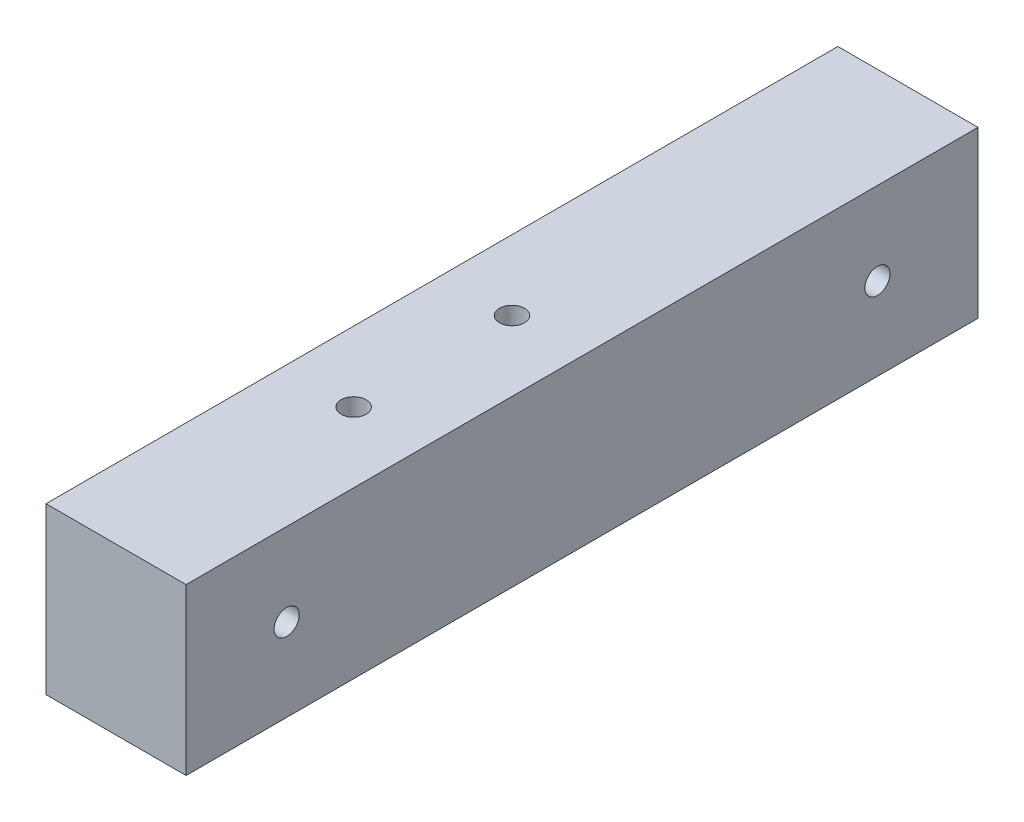
ISO-10303-21;
HEADER;
FILE_DESCRIPTION(('STEP AP214'),'2;1');
FILE_NAME('part.step','',(''),(''),'','','');
FILE_SCHEMA(('AUTOMOTIVE_DESIGN { 1 0 10303 214 1 1 1 1 }'));
ENDSEC;
DATA;
#1=APPLICATION_CONTEXT('core data for automotive mechanical design processes');
#2=APPLICATION_PROTOCOL_DEFINITION('international standard','automotive_design',2000,#1);
#3=PRODUCT_CONTEXT('',#1,'mechanical');
#4=PRODUCT('Part','Part','',(#3));
#5=PRODUCT_RELATED_PRODUCT_CATEGORY('part','',(#4));
#6=PRODUCT_DEFINITION_FORMATION('','',#4);
#7=PRODUCT_DEFINITION_CONTEXT('part definition',#1,'design');
#8=PRODUCT_DEFINITION('design','',#6,#7);
#9=PRODUCT_DEFINITION_SHAPE('','',#8);
#10=(LENGTH_UNIT() NAMED_UNIT(*) SI_UNIT(.MILLI.,.METRE.));
#11=(NAMED_UNIT(*) PLANE_ANGLE_UNIT() SI_UNIT($,.RADIAN.));
#12=(NAMED_UNIT(*) SI_UNIT($,.STERADIAN.) SOLID_ANGLE_UNIT());
#13=UNCERTAINTY_MEASURE_WITH_UNIT(LENGTH_MEASURE(1.E-05),#10,'distance_accuracy_value','');
#14=(GEOMETRIC_REPRESENTATION_CONTEXT(3) GLOBAL_UNCERTAINTY_ASSIGNED_CONTEXT((#13)) GLOBAL_UNIT_ASSIGNED_CONTEXT((#10,
#11,#12)) REPRESENTATION_CONTEXT('',''));
#15=CARTESIAN_POINT('',(0.,0.,0.));
#16=DIRECTION('',(0.,0.,1.));
#17=DIRECTION('',(1.,0.,0.));
#18=AXIS2_PLACEMENT_3D('',#15,#16,#17);
#19=CARTESIAN_POINT('',(0.,0.,100.));
#20=DIRECTION('',(1.,0.,0.));
#21=DIRECTION('',(0.,1.,0.));
#22=AXIS2_PLACEMENT_3D('',#19,#20,#21);
#23=PLANE('',#22);
#24=CARTESIAN_POINT('',(0.,10.44,87.3));
#25=DIRECTION('',(1.,0.,0.));
#26=DIRECTION('',(0.,1.,0.));
#27=AXIS2_PLACEMENT_3D('',#24,#25,#26);
#28=CIRCLE('',#27,1.5875);
#29=CARTESIAN_POINT('',(0.,12.0275,87.3));
#30=VERTEX_POINT('',#29);
#31=EDGE_CURVE('E118',#30,#30,#28,.T.);
#32=ORIENTED_EDGE('',*,*,#31,.T.);
#33=EDGE_LOOP('',(#32));
#34=FACE_BOUND('',#33,.T.);
#35=CARTESIAN_POINT('',(0.,10.44,12.7));
#36=DIRECTION('',(1.,0.,0.));
#37=DIRECTION('',(0.,1.,0.));
#38=AXIS2_PLACEMENT_3D('',#35,#36,#37);
#39=CIRCLE('',#38,1.5875);
#40=CARTESIAN_POINT('',(0.,12.0275,12.7));
#41=VERTEX_POINT('',#40);
#42=EDGE_CURVE('E123',#41,#41,#39,.T.);
#43=ORIENTED_EDGE('',*,*,#42,.T.);
#44=EDGE_LOOP('',(#43));
#45=FACE_BOUND('',#44,.T.);
#46=DIRECTION('',(0.,-1.,0.));
#47=VECTOR('',#46,1.);
#48=CARTESIAN_POINT('',(0.,0.,0.));
#49=LINE('',#48,#47);
#50=CARTESIAN_POINT('',(0.,20.88,0.));
#51=VERTEX_POINT('',#50);
#52=CARTESIAN_POINT('',(0.,0.,0.));
#53=VERTEX_POINT('',#52);
#54=EDGE_CURVE('E95',#51,#53,#49,.T.);
#55=ORIENTED_EDGE('',*,*,#54,.T.);
#56=DIRECTION('',(0.,0.,-1.));
#57=VECTOR('',#56,1.);
#58=CARTESIAN_POINT('',(0.,0.,100.));
#59=LINE('',#58,#57);
#60=CARTESIAN_POINT('',(0.,0.,100.));
#61=VERTEX_POINT('',#60);
#62=EDGE_CURVE('E11',#61,#53,#59,.T.);
#63=ORIENTED_EDGE('',*,*,#62,.F.);
#64=DIRECTION('',(0.,-1.,0.));
#65=VECTOR('',#64,1.);
#66=CARTESIAN_POINT('',(0.,0.,100.));
#67=LINE('',#66,#65);
#68=CARTESIAN_POINT('',(0.,20.88,100.));
#69=VERTEX_POINT('',#68);
#70=EDGE_CURVE('E83',#69,#61,#67,.T.);
#71=ORIENTED_EDGE('',*,*,#70,.F.);
#72=DIRECTION('',(0.,0.,-1.));
#73=VECTOR('',#72,1.);
#74=CARTESIAN_POINT('',(0.,20.88,100.));
#75=LINE('',#74,#73);
#76=EDGE_CURVE('E91',#69,#51,#75,.T.);
#77=ORIENTED_EDGE('',*,*,#76,.T.);
#78=EDGE_LOOP('',(#55,#63,#71,#77));
#79=FACE_BOUND('',#78,.T.);
#80=ADVANCED_FACE('F32',(#34,#45,#79),#23,.F.);
#81=CARTESIAN_POINT('',(0.,0.,100.));
#82=DIRECTION('',(0.,1.,0.));
#83=DIRECTION('',(0.,0.,1.));
#84=AXIS2_PLACEMENT_3D('',#81,#82,#83);
#85=PLANE('',#84);
#86=CARTESIAN_POINT('',(8.845,0.,50.));
#87=DIRECTION('',(0.,1.,0.));
#88=DIRECTION('',(0.,0.,1.));
#89=AXIS2_PLACEMENT_3D('',#86,#87,#88);
#90=CIRCLE('',#89,1.5875);
#91=CARTESIAN_POINT('',(8.845,0.,51.5875));
#92=VERTEX_POINT('',#91);
#93=EDGE_CURVE('E98',#92,#92,#90,.T.);
#94=ORIENTED_EDGE('',*,*,#93,.T.);
#95=EDGE_LOOP('',(#94));
#96=FACE_BOUND('',#95,.T.);
#97=CARTESIAN_POINT('',(8.845,0.,70.));
#98=DIRECTION('',(0.,1.,0.));
#99=DIRECTION('',(0.,0.,1.));
#100=AXIS2_PLACEMENT_3D('',#97,#98,#99);
#101=CIRCLE('',#100,1.5875);
#102=CARTESIAN_POINT('',(8.845,0.,71.5875));
#103=VERTEX_POINT('',#102);
#104=EDGE_CURVE('E111',#103,#103,#101,.T.);
#105=ORIENTED_EDGE('',*,*,#104,.T.);
#106=EDGE_LOOP('',(#105));
#107=FACE_BOUND('',#106,.T.);
#108=DIRECTION('',(1.,0.,0.));
#109=VECTOR('',#108,1.);
#110=CARTESIAN_POINT('',(0.,0.,0.));
#111=LINE('',#110,#109);
#112=CARTESIAN_POINT('',(17.69,0.,0.));
#113=VERTEX_POINT('',#112);
#114=EDGE_CURVE('E87',#53,#113,#111,.T.);
#115=ORIENTED_EDGE('',*,*,#114,.T.);
#116=DIRECTION('',(0.,0.,-1.));
#117=VECTOR('',#116,1.);
#118=CARTESIAN_POINT('',(17.69,0.,100.));
#119=LINE('',#118,#117);
#120=CARTESIAN_POINT('',(17.69,0.,100.));
#121=VERTEX_POINT('',#120);
#122=EDGE_CURVE('E40',#121,#113,#119,.T.);
#123=ORIENTED_EDGE('',*,*,#122,.F.);
#124=DIRECTION('',(1.,0.,0.));
#125=VECTOR('',#124,1.);
#126=CARTESIAN_POINT('',(0.,0.,100.));
#127=LINE('',#126,#125);
#128=EDGE_CURVE('E78',#61,#121,#127,.T.);
#129=ORIENTED_EDGE('',*,*,#128,.F.);
#130=ORIENTED_EDGE('',*,*,#62,.T.);
#131=EDGE_LOOP('',(#115,#123,#129,#130));
#132=FACE_BOUND('',#131,.T.);
#133=ADVANCED_FACE('F86',(#96,#107,#132),#85,.F.);
#134=CARTESIAN_POINT('',(17.69,0.,100.));
#135=DIRECTION('',(-1.,0.,0.));
#136=DIRECTION('',(0.,-1.,0.));
#137=AXIS2_PLACEMENT_3D('',#134,#135,#136);
#138=PLANE('',#137);
#139=CARTESIAN_POINT('',(17.69,10.44,87.3));
#140=DIRECTION('',(1.,0.,0.));
#141=DIRECTION('',(0.,1.,0.));
#142=AXIS2_PLACEMENT_3D('',#139,#140,#141);
#143=CIRCLE('',#142,1.5875);
#144=CARTESIAN_POINT('',(17.69,12.0275,87.3));
#145=VERTEX_POINT('',#144);
#146=EDGE_CURVE('E126',#145,#145,#143,.T.);
#147=ORIENTED_EDGE('',*,*,#146,.F.);
#148=EDGE_LOOP('',(#147));
#149=FACE_BOUND('',#148,.T.);
#150=CARTESIAN_POINT('',(17.69,10.44,12.7));
#151=DIRECTION('',(1.,0.,0.));
#152=DIRECTION('',(0.,1.,0.));
#153=AXIS2_PLACEMENT_3D('',#150,#151,#152);
#154=CIRCLE('',#153,1.5875);
#155=CARTESIAN_POINT('',(17.69,12.0275,12.7));
#156=VERTEX_POINT('',#155);
#157=EDGE_CURVE('E127',#156,#156,#154,.T.);
#158=ORIENTED_EDGE('',*,*,#157,.F.);
#159=EDGE_LOOP('',(#158));
#160=FACE_BOUND('',#159,.T.);
#161=DIRECTION('',(0.,1.,0.));
#162=VECTOR('',#161,1.);
#163=CARTESIAN_POINT('',(17.69,0.,0.));
#164=LINE('',#163,#162);
#165=CARTESIAN_POINT('',(17.69,20.88,0.));
#166=VERTEX_POINT('',#165);
#167=EDGE_CURVE('E65',#113,#166,#164,.T.);
#168=ORIENTED_EDGE('',*,*,#167,.T.);
#169=DIRECTION('',(0.,0.,-1.));
#170=VECTOR('',#169,1.);
#171=CARTESIAN_POINT('',(17.69,20.88,100.));
#172=LINE('',#171,#170);
#173=CARTESIAN_POINT('',(17.69,20.88,100.));
#174=VERTEX_POINT('',#173);
#175=EDGE_CURVE('E88',#174,#166,#172,.T.);
#176=ORIENTED_EDGE('',*,*,#175,.F.);
#177=DIRECTION('',(0.,1.,0.));
#178=VECTOR('',#177,1.);
#179=CARTESIAN_POINT('',(17.69,0.,100.));
#180=LINE('',#179,#178);
#181=EDGE_CURVE('E81',#121,#174,#180,.T.);
#182=ORIENTED_EDGE('',*,*,#181,.F.);
#183=ORIENTED_EDGE('',*,*,#122,.T.);
#184=EDGE_LOOP('',(#168,#176,#182,#183));
#185=FACE_BOUND('',#184,.T.);
#186=ADVANCED_FACE('F89',(#149,#160,#185),#138,.F.);
#187=CARTESIAN_POINT('',(0.,20.88,100.));
#188=DIRECTION('',(0.,-1.,0.));
#189=DIRECTION('',(0.,0.,-1.));
#190=AXIS2_PLACEMENT_3D('',#187,#188,#189);
#191=PLANE('',#190);
#192=CARTESIAN_POINT('',(8.845,20.88,50.));
#193=DIRECTION('',(0.,1.,0.));
#194=DIRECTION('',(0.,0.,1.));
#195=AXIS2_PLACEMENT_3D('',#192,#193,#194);
#196=CIRCLE('',#195,1.5875);
#197=CARTESIAN_POINT('',(8.845,20.88,51.5875));
#198=VERTEX_POINT('',#197);
#199=EDGE_CURVE('E114',#198,#198,#196,.T.);
#200=ORIENTED_EDGE('',*,*,#199,.F.);
#201=EDGE_LOOP('',(#200));
#202=FACE_BOUND('',#201,.T.);
#203=CARTESIAN_POINT('',(8.845,20.88,70.));
#204=DIRECTION('',(0.,1.,0.));
#205=DIRECTION('',(0.,0.,1.));
#206=AXIS2_PLACEMENT_3D('',#203,#204,#205);
#207=CIRCLE('',#206,1.5875);
#208=CARTESIAN_POINT('',(8.845,20.88,71.5875));
#209=VERTEX_POINT('',#208);
#210=EDGE_CURVE('E115',#209,#209,#207,.T.);
#211=ORIENTED_EDGE('',*,*,#210,.F.);
#212=EDGE_LOOP('',(#211));
#213=FACE_BOUND('',#212,.T.);
#214=DIRECTION('',(-1.,0.,0.));
#215=VECTOR('',#214,1.);
#216=CARTESIAN_POINT('',(0.,20.88,0.));
#217=LINE('',#216,#215);
#218=EDGE_CURVE('E71',#166,#51,#217,.T.);
#219=ORIENTED_EDGE('',*,*,#218,.T.);
#220=ORIENTED_EDGE('',*,*,#76,.F.);
#221=DIRECTION('',(-1.,0.,0.));
#222=VECTOR('',#221,1.);
#223=CARTESIAN_POINT('',(0.,20.88,100.));
#224=LINE('',#223,#222);
#225=EDGE_CURVE('E48',#174,#69,#224,.T.);
#226=ORIENTED_EDGE('',*,*,#225,.F.);
#227=ORIENTED_EDGE('',*,*,#175,.T.);
#228=EDGE_LOOP('',(#219,#220,#226,#227));
#229=FACE_BOUND('',#228,.T.);
#230=ADVANCED_FACE('F103',(#202,#213,#229),#191,.F.);
#231=CARTESIAN_POINT('',(0.,0.,100.));
#232=DIRECTION('',(0.,0.,-1.));
#233=DIRECTION('',(-1.,0.,0.));
#234=AXIS2_PLACEMENT_3D('',#231,#232,#233);
#235=PLANE('',#234);
#236=ORIENTED_EDGE('',*,*,#70,.T.);
#237=ORIENTED_EDGE('',*,*,#128,.T.);
#238=ORIENTED_EDGE('',*,*,#181,.T.);
#239=ORIENTED_EDGE('',*,*,#225,.T.);
#240=EDGE_LOOP('',(#236,#237,#238,#239));
#241=FACE_BOUND('',#240,.T.);
#242=ADVANCED_FACE('F79',(#241),#235,.F.);
#243=CARTESIAN_POINT('',(0.,0.,0.));
#244=DIRECTION('',(0.,0.,-1.));
#245=DIRECTION('',(-1.,0.,0.));
#246=AXIS2_PLACEMENT_3D('',#243,#244,#245);
#247=PLANE('',#246);
#248=ORIENTED_EDGE('',*,*,#54,.F.);
#249=ORIENTED_EDGE('',*,*,#218,.F.);
#250=ORIENTED_EDGE('',*,*,#167,.F.);
#251=ORIENTED_EDGE('',*,*,#114,.F.);
#252=EDGE_LOOP('',(#248,#249,#250,#251));
#253=FACE_BOUND('',#252,.T.);
#254=ADVANCED_FACE('F106',(#253),#247,.T.);
#255=CARTESIAN_POINT('',(8.845,-85.9,70.));
#256=DIRECTION('',(0.,1.,0.));
#257=DIRECTION('',(0.,0.,1.));
#258=AXIS2_PLACEMENT_3D('',#255,#256,#257);
#259=CYLINDRICAL_SURFACE('',#258,1.5875);
#260=ORIENTED_EDGE('',*,*,#210,.T.);
#261=EDGE_LOOP('',(#260));
#262=FACE_BOUND('',#261,.T.);
#263=ORIENTED_EDGE('',*,*,#104,.F.);
#264=EDGE_LOOP('',(#263));
#265=FACE_BOUND('',#264,.T.);
#266=ADVANCED_FACE('F163',(#262,#265),#259,.F.);
#267=CARTESIAN_POINT('',(8.845,-85.9,50.));
#268=DIRECTION('',(0.,1.,0.));
#269=DIRECTION('',(0.,0.,1.));
#270=AXIS2_PLACEMENT_3D('',#267,#268,#269);
#271=CYLINDRICAL_SURFACE('',#270,1.5875);
#272=ORIENTED_EDGE('',*,*,#199,.T.);
#273=EDGE_LOOP('',(#272));
#274=FACE_BOUND('',#273,.T.);
#275=ORIENTED_EDGE('',*,*,#93,.F.);
#276=EDGE_LOOP('',(#275));
#277=FACE_BOUND('',#276,.T.);
#278=ADVANCED_FACE('F144',(#274,#277),#271,.F.);
#279=CARTESIAN_POINT('',(-82.31,10.44,12.7));
#280=DIRECTION('',(1.,0.,0.));
#281=DIRECTION('',(0.,1.,0.));
#282=AXIS2_PLACEMENT_3D('',#279,#280,#281);
#283=CYLINDRICAL_SURFACE('',#282,1.5875);
#284=ORIENTED_EDGE('',*,*,#157,.T.);
#285=EDGE_LOOP('',(#284));
#286=FACE_BOUND('',#285,.T.);
#287=ORIENTED_EDGE('',*,*,#42,.F.);
#288=EDGE_LOOP('',(#287));
#289=FACE_BOUND('',#288,.T.);
#290=ADVANCED_FACE('F141',(#286,#289),#283,.F.);
#291=CARTESIAN_POINT('',(-82.31,10.44,87.3));
#292=DIRECTION('',(1.,0.,0.));
#293=DIRECTION('',(0.,1.,0.));
#294=AXIS2_PLACEMENT_3D('',#291,#292,#293);
#295=CYLINDRICAL_SURFACE('',#294,1.5875);
#296=ORIENTED_EDGE('',*,*,#146,.T.);
#297=EDGE_LOOP('',(#296));
#298=FACE_BOUND('',#297,.T.);
#299=ORIENTED_EDGE('',*,*,#31,.F.);
#300=EDGE_LOOP('',(#299));
#301=FACE_BOUND('',#300,.T.);
#302=ADVANCED_FACE('F133',(#298,#301),#295,.F.);
#303=CLOSED_SHELL('',(#80,#133,#186,#230,#242,#254,#266,#278,#290,#302));
#304=MANIFOLD_SOLID_BREP('B2',#303);
#305=ADVANCED_BREP_SHAPE_REPRESENTATION('',(#18,#304),#14);
#306=SHAPE_DEFINITION_REPRESENTATION(#9,#305);
ENDSEC;
END-ISO-10303-21;
